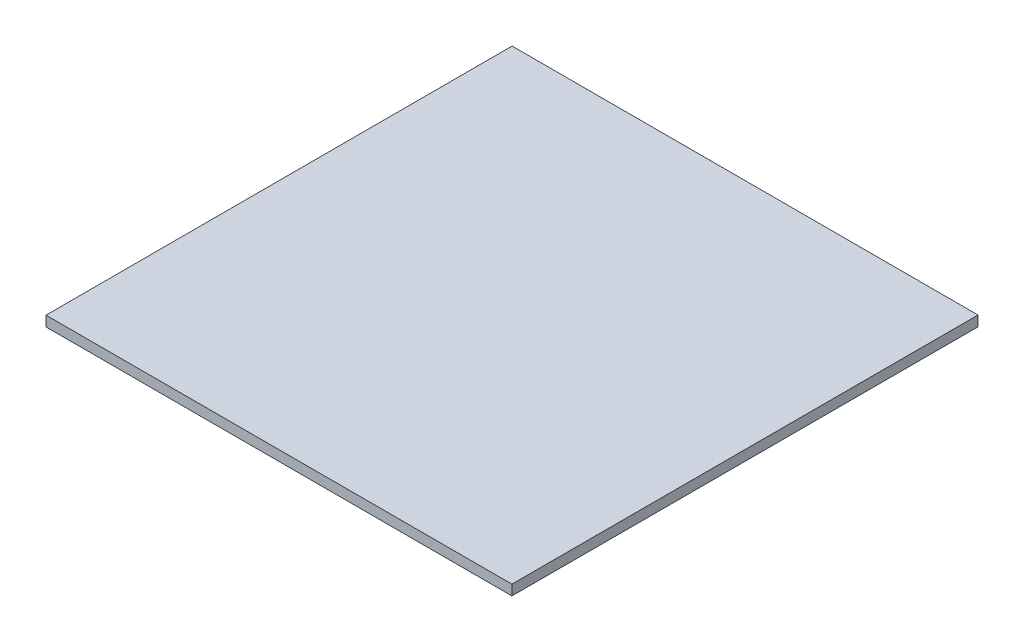
ISO-10303-21;
HEADER;
FILE_DESCRIPTION(('STEP AP214'),'2;1');
FILE_NAME('part.step','',(''),(''),'','','');
FILE_SCHEMA(('AUTOMOTIVE_DESIGN { 1 0 10303 214 1 1 1 1 }'));
ENDSEC;
DATA;
#1=APPLICATION_CONTEXT('core data for automotive mechanical design processes');
#2=APPLICATION_PROTOCOL_DEFINITION('international standard','automotive_design',2000,#1);
#3=PRODUCT_CONTEXT('',#1,'mechanical');
#4=PRODUCT('Part','Part','',(#3));
#5=PRODUCT_RELATED_PRODUCT_CATEGORY('part','',(#4));
#6=PRODUCT_DEFINITION_FORMATION('','',#4);
#7=PRODUCT_DEFINITION_CONTEXT('part definition',#1,'design');
#8=PRODUCT_DEFINITION('design','',#6,#7);
#9=PRODUCT_DEFINITION_SHAPE('','',#8);
#10=(LENGTH_UNIT() NAMED_UNIT(*) SI_UNIT(.MILLI.,.METRE.));
#11=(NAMED_UNIT(*) PLANE_ANGLE_UNIT() SI_UNIT($,.RADIAN.));
#12=(NAMED_UNIT(*) SI_UNIT($,.STERADIAN.) SOLID_ANGLE_UNIT());
#13=UNCERTAINTY_MEASURE_WITH_UNIT(LENGTH_MEASURE(1.E-05),#10,'distance_accuracy_value','');
#14=(GEOMETRIC_REPRESENTATION_CONTEXT(3) GLOBAL_UNCERTAINTY_ASSIGNED_CONTEXT((#13)) GLOBAL_UNIT_ASSIGNED_CONTEXT((#10,
#11,#12)) REPRESENTATION_CONTEXT('',''));
#15=CARTESIAN_POINT('',(0.,0.,0.));
#16=DIRECTION('',(0.,0.,1.));
#17=DIRECTION('',(1.,0.,0.));
#18=AXIS2_PLACEMENT_3D('',#15,#16,#17);
#19=CARTESIAN_POINT('',(-29.3567260691816,6.35963280943233,31.6363637871034));
#20=DIRECTION('',(0.,0.,-1.));
#21=DIRECTION('',(-1.,0.,0.));
#22=AXIS2_PLACEMENT_3D('',#19,#20,#21);
#23=PLANE('',#22);
#24=DIRECTION('',(1.,0.,0.));
#25=VECTOR('',#24,1.);
#26=CARTESIAN_POINT('',(-29.3567260691816,0.,31.6363637871034));
#27=LINE('',#26,#25);
#28=CARTESIAN_POINT('',(-29.3567260691816,0.,31.6363637871034));
#29=VERTEX_POINT('',#28);
#30=CARTESIAN_POINT('',(260.17856152416,0.,31.6363637871034));
#31=VERTEX_POINT('',#30);
#32=EDGE_CURVE('E99',#29,#31,#27,.T.);
#33=ORIENTED_EDGE('',*,*,#32,.T.);
#34=DIRECTION('',(0.,-1.,0.));
#35=VECTOR('',#34,1.);
#36=CARTESIAN_POINT('',(260.17856152416,6.35963280943233,31.6363637871034));
#37=LINE('',#36,#35);
#38=CARTESIAN_POINT('',(260.17856152416,6.35963280943233,31.6363637871034));
#39=VERTEX_POINT('',#38);
#40=EDGE_CURVE('E11',#39,#31,#37,.T.);
#41=ORIENTED_EDGE('',*,*,#40,.F.);
#42=DIRECTION('',(1.,0.,0.));
#43=VECTOR('',#42,1.);
#44=CARTESIAN_POINT('',(-29.3567260691816,6.35963280943233,31.6363637871034));
#45=LINE('',#44,#43);
#46=CARTESIAN_POINT('',(-29.3567260691816,6.35963280943233,31.6363637871034));
#47=VERTEX_POINT('',#46);
#48=EDGE_CURVE('E76',#47,#39,#45,.T.);
#49=ORIENTED_EDGE('',*,*,#48,.F.);
#50=DIRECTION('',(0.,-1.,0.));
#51=VECTOR('',#50,1.);
#52=CARTESIAN_POINT('',(-29.3567260691816,6.35963280943233,31.6363637871034));
#53=LINE('',#52,#51);
#54=EDGE_CURVE('E95',#47,#29,#53,.T.);
#55=ORIENTED_EDGE('',*,*,#54,.T.);
#56=EDGE_LOOP('',(#33,#41,#49,#55));
#57=FACE_BOUND('',#56,.T.);
#58=ADVANCED_FACE('F37',(#57),#23,.F.);
#59=CARTESIAN_POINT('',(260.17856152416,6.35963280943233,-258.026660651296));
#60=DIRECTION('',(1.,0.,0.));
#61=DIRECTION('',(0.,0.,-1.));
#62=AXIS2_PLACEMENT_3D('',#59,#60,#61);
#63=PLANE('',#62);
#64=DIRECTION('',(0.,0.,1.));
#65=VECTOR('',#64,1.);
#66=CARTESIAN_POINT('',(260.17856152416,0.,-258.026660651296));
#67=LINE('',#66,#65);
#68=CARTESIAN_POINT('',(260.17856152416,0.,-258.026660651296));
#69=VERTEX_POINT('',#68);
#70=EDGE_CURVE('E85',#69,#31,#67,.T.);
#71=ORIENTED_EDGE('',*,*,#70,.F.);
#72=DIRECTION('',(0.,-1.,0.));
#73=VECTOR('',#72,1.);
#74=CARTESIAN_POINT('',(260.17856152416,6.35963280943233,-258.026660651296));
#75=LINE('',#74,#73);
#76=CARTESIAN_POINT('',(260.17856152416,6.35963280943233,-258.026660651296));
#77=VERTEX_POINT('',#76);
#78=EDGE_CURVE('E45',#77,#69,#75,.T.);
#79=ORIENTED_EDGE('',*,*,#78,.F.);
#80=DIRECTION('',(0.,0.,1.));
#81=VECTOR('',#80,1.);
#82=CARTESIAN_POINT('',(260.17856152416,6.35963280943233,-258.026660651296));
#83=LINE('',#82,#81);
#84=EDGE_CURVE('E83',#77,#39,#83,.T.);
#85=ORIENTED_EDGE('',*,*,#84,.T.);
#86=ORIENTED_EDGE('',*,*,#40,.T.);
#87=EDGE_LOOP('',(#71,#79,#85,#86));
#88=FACE_BOUND('',#87,.T.);
#89=ADVANCED_FACE('F82',(#88),#63,.T.);
#90=CARTESIAN_POINT('',(-29.3567260691816,6.35963280943233,-258.026660651296));
#91=DIRECTION('',(0.,0.,-1.));
#92=DIRECTION('',(-1.,0.,0.));
#93=AXIS2_PLACEMENT_3D('',#90,#91,#92);
#94=PLANE('',#93);
#95=DIRECTION('',(1.,0.,0.));
#96=VECTOR('',#95,1.);
#97=CARTESIAN_POINT('',(-29.3567260691816,0.,-258.026660651296));
#98=LINE('',#97,#96);
#99=CARTESIAN_POINT('',(-29.3567260691816,0.,-258.026660651296));
#100=VERTEX_POINT('',#99);
#101=EDGE_CURVE('E103',#100,#69,#98,.T.);
#102=ORIENTED_EDGE('',*,*,#101,.F.);
#103=DIRECTION('',(0.,-1.,0.));
#104=VECTOR('',#103,1.);
#105=CARTESIAN_POINT('',(-29.3567260691816,6.35963280943233,-258.026660651296));
#106=LINE('',#105,#104);
#107=CARTESIAN_POINT('',(-29.3567260691816,6.35963280943233,-258.026660651296));
#108=VERTEX_POINT('',#107);
#109=EDGE_CURVE('E68',#108,#100,#106,.T.);
#110=ORIENTED_EDGE('',*,*,#109,.F.);
#111=DIRECTION('',(1.,0.,0.));
#112=VECTOR('',#111,1.);
#113=CARTESIAN_POINT('',(-29.3567260691816,6.35963280943233,-258.026660651296));
#114=LINE('',#113,#112);
#115=EDGE_CURVE('E91',#108,#77,#114,.T.);
#116=ORIENTED_EDGE('',*,*,#115,.T.);
#117=ORIENTED_EDGE('',*,*,#78,.T.);
#118=EDGE_LOOP('',(#102,#110,#116,#117));
#119=FACE_BOUND('',#118,.T.);
#120=ADVANCED_FACE('F93',(#119),#94,.T.);
#121=CARTESIAN_POINT('',(-29.3567260691816,6.35963280943233,-258.026660651296));
#122=DIRECTION('',(1.,0.,0.));
#123=DIRECTION('',(0.,0.,-1.));
#124=AXIS2_PLACEMENT_3D('',#121,#122,#123);
#125=PLANE('',#124);
#126=DIRECTION('',(0.,0.,1.));
#127=VECTOR('',#126,1.);
#128=CARTESIAN_POINT('',(-29.3567260691816,0.,-258.026660651296));
#129=LINE('',#128,#127);
#130=EDGE_CURVE('E71',#100,#29,#129,.T.);
#131=ORIENTED_EDGE('',*,*,#130,.T.);
#132=ORIENTED_EDGE('',*,*,#54,.F.);
#133=DIRECTION('',(0.,0.,1.));
#134=VECTOR('',#133,1.);
#135=CARTESIAN_POINT('',(-29.3567260691816,6.35963280943233,-258.026660651296));
#136=LINE('',#135,#134);
#137=EDGE_CURVE('E53',#108,#47,#136,.T.);
#138=ORIENTED_EDGE('',*,*,#137,.F.);
#139=ORIENTED_EDGE('',*,*,#109,.T.);
#140=EDGE_LOOP('',(#131,#132,#138,#139));
#141=FACE_BOUND('',#140,.T.);
#142=ADVANCED_FACE('F116',(#141),#125,.F.);
#143=CARTESIAN_POINT('',(0.,6.35963280943233,0.));
#144=DIRECTION('',(0.,-1.,0.));
#145=DIRECTION('',(0.,0.,-1.));
#146=AXIS2_PLACEMENT_3D('',#143,#144,#145);
#147=PLANE('',#146);
#148=ORIENTED_EDGE('',*,*,#48,.T.);
#149=ORIENTED_EDGE('',*,*,#84,.F.);
#150=ORIENTED_EDGE('',*,*,#115,.F.);
#151=ORIENTED_EDGE('',*,*,#137,.T.);
#152=EDGE_LOOP('',(#148,#149,#150,#151));
#153=FACE_BOUND('',#152,.T.);
#154=ADVANCED_FACE('F90',(#153),#147,.F.);
#155=CARTESIAN_POINT('',(0.,0.,0.));
#156=DIRECTION('',(0.,-1.,0.));
#157=DIRECTION('',(0.,0.,-1.));
#158=AXIS2_PLACEMENT_3D('',#155,#156,#157);
#159=PLANE('',#158);
#160=ORIENTED_EDGE('',*,*,#32,.F.);
#161=ORIENTED_EDGE('',*,*,#130,.F.);
#162=ORIENTED_EDGE('',*,*,#101,.T.);
#163=ORIENTED_EDGE('',*,*,#70,.T.);
#164=EDGE_LOOP('',(#160,#161,#162,#163));
#165=FACE_BOUND('',#164,.T.);
#166=ADVANCED_FACE('F110',(#165),#159,.T.);
#167=CLOSED_SHELL('',(#58,#89,#120,#142,#154,#166));
#168=MANIFOLD_SOLID_BREP('B2',#167);
#169=ADVANCED_BREP_SHAPE_REPRESENTATION('',(#18,#168),#14);
#170=SHAPE_DEFINITION_REPRESENTATION(#9,#169);
ENDSEC;
END-ISO-10303-21;
